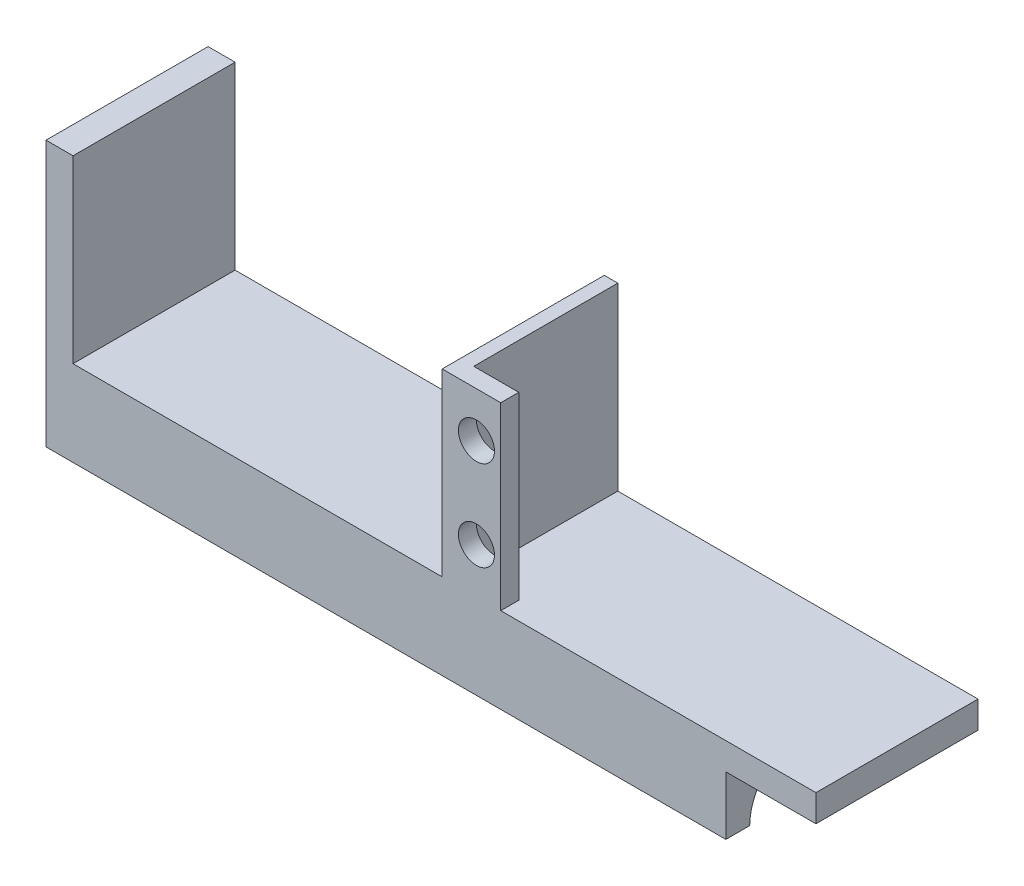
ISO-10303-21;
HEADER;
FILE_DESCRIPTION(('STEP AP214'),'2;1');
FILE_NAME('part.step','',(''),(''),'','','');
FILE_SCHEMA(('AUTOMOTIVE_DESIGN { 1 0 10303 214 1 1 1 1 }'));
ENDSEC;
DATA;
#1=APPLICATION_CONTEXT('core data for automotive mechanical design processes');
#2=APPLICATION_PROTOCOL_DEFINITION('international standard','automotive_design',2000,#1);
#3=PRODUCT_CONTEXT('',#1,'mechanical');
#4=PRODUCT('Part','Part','',(#3));
#5=PRODUCT_RELATED_PRODUCT_CATEGORY('part','',(#4));
#6=PRODUCT_DEFINITION_FORMATION('','',#4);
#7=PRODUCT_DEFINITION_CONTEXT('part definition',#1,'design');
#8=PRODUCT_DEFINITION('design','',#6,#7);
#9=PRODUCT_DEFINITION_SHAPE('','',#8);
#10=(LENGTH_UNIT() NAMED_UNIT(*) SI_UNIT(.MILLI.,.METRE.));
#11=(NAMED_UNIT(*) PLANE_ANGLE_UNIT() SI_UNIT($,.RADIAN.));
#12=(NAMED_UNIT(*) SI_UNIT($,.STERADIAN.) SOLID_ANGLE_UNIT());
#13=UNCERTAINTY_MEASURE_WITH_UNIT(LENGTH_MEASURE(1.E-05),#10,'distance_accuracy_value','');
#14=(GEOMETRIC_REPRESENTATION_CONTEXT(3) GLOBAL_UNCERTAINTY_ASSIGNED_CONTEXT((#13)) GLOBAL_UNIT_ASSIGNED_CONTEXT((#10,
#11,#12)) REPRESENTATION_CONTEXT('',''));
#15=CARTESIAN_POINT('',(0.,0.,0.));
#16=DIRECTION('',(0.,0.,1.));
#17=DIRECTION('',(1.,0.,0.));
#18=AXIS2_PLACEMENT_3D('',#15,#16,#17);
#19=CARTESIAN_POINT('',(22.75,3.,9.));
#20=DIRECTION('',(-1.,0.,0.));
#21=DIRECTION('',(0.,0.,1.));
#22=AXIS2_PLACEMENT_3D('',#19,#20,#21);
#23=PLANE('',#22);
#24=DIRECTION('',(0.,0.,1.));
#25=VECTOR('',#24,1.);
#26=CARTESIAN_POINT('',(22.75,3.,9.));
#27=LINE('',#26,#25);
#28=CARTESIAN_POINT('',(22.75,3.,-9.));
#29=VERTEX_POINT('',#28);
#30=CARTESIAN_POINT('',(22.75,3.,7.));
#31=VERTEX_POINT('',#30);
#32=EDGE_CURVE('E102',#29,#31,#27,.T.);
#33=ORIENTED_EDGE('',*,*,#32,.F.);
#34=DIRECTION('',(0.,-1.,0.));
#35=VECTOR('',#34,1.);
#36=CARTESIAN_POINT('',(22.75,3.,-9.));
#37=LINE('',#36,#35);
#38=CARTESIAN_POINT('',(22.75,23.,-9.));
#39=VERTEX_POINT('',#38);
#40=EDGE_CURVE('E12',#39,#29,#37,.T.);
#41=ORIENTED_EDGE('',*,*,#40,.F.);
#42=DIRECTION('',(0.,0.,-1.));
#43=VECTOR('',#42,1.);
#44=CARTESIAN_POINT('',(22.75,23.,-9.));
#45=LINE('',#44,#43);
#46=CARTESIAN_POINT('',(22.75,23.,7.));
#47=VERTEX_POINT('',#46);
#48=EDGE_CURVE('E107',#47,#39,#45,.T.);
#49=ORIENTED_EDGE('',*,*,#48,.F.);
#50=DIRECTION('',(0.,1.,0.));
#51=VECTOR('',#50,1.);
#52=CARTESIAN_POINT('',(22.75,23.,7.));
#53=LINE('',#52,#51);
#54=EDGE_CURVE('E263',#31,#47,#53,.T.);
#55=ORIENTED_EDGE('',*,*,#54,.F.);
#56=EDGE_LOOP('',(#33,#41,#49,#55));
#57=FACE_BOUND('',#56,.T.);
#58=ADVANCED_FACE('F86',(#57),#23,.F.);
#59=CARTESIAN_POINT('',(-22.75,3.,9.));
#60=DIRECTION('',(0.,0.,-1.));
#61=DIRECTION('',(-1.,0.,0.));
#62=AXIS2_PLACEMENT_3D('',#59,#60,#61);
#63=PLANE('',#62);
#64=DIRECTION('',(0.,-1.,0.));
#65=VECTOR('',#64,1.);
#66=CARTESIAN_POINT('',(52.75,0.,9.));
#67=LINE('',#66,#65);
#68=CARTESIAN_POINT('',(52.75,0.,9.));
#69=VERTEX_POINT('',#68);
#70=CARTESIAN_POINT('',(52.75,-6.5,9.));
#71=VERTEX_POINT('',#70);
#72=EDGE_CURVE('E222',#69,#71,#67,.T.);
#73=ORIENTED_EDGE('',*,*,#72,.F.);
#74=DIRECTION('',(-1.,0.,0.));
#75=VECTOR('',#74,1.);
#76=CARTESIAN_POINT('',(62.75,0.,9.));
#77=LINE('',#76,#75);
#78=CARTESIAN_POINT('',(62.75,0.,9.));
#79=VERTEX_POINT('',#78);
#80=EDGE_CURVE('E207',#79,#69,#77,.T.);
#81=ORIENTED_EDGE('',*,*,#80,.F.);
#82=DIRECTION('',(0.,-1.,0.));
#83=VECTOR('',#82,1.);
#84=CARTESIAN_POINT('',(62.75,0.,9.));
#85=LINE('',#84,#83);
#86=CARTESIAN_POINT('',(62.75,3.,9.));
#87=VERTEX_POINT('',#86);
#88=EDGE_CURVE('E211',#87,#79,#85,.T.);
#89=ORIENTED_EDGE('',*,*,#88,.F.);
#90=DIRECTION('',(-1.,0.,0.));
#91=VECTOR('',#90,1.);
#92=CARTESIAN_POINT('',(62.75,3.,9.));
#93=LINE('',#92,#91);
#94=CARTESIAN_POINT('',(27.75,3.,9.));
#95=VERTEX_POINT('',#94);
#96=EDGE_CURVE('E241',#87,#95,#93,.T.);
#97=ORIENTED_EDGE('',*,*,#96,.T.);
#98=DIRECTION('',(0.,-1.,0.));
#99=VECTOR('',#98,1.);
#100=CARTESIAN_POINT('',(27.75,23.,9.));
#101=LINE('',#100,#99);
#102=CARTESIAN_POINT('',(27.75,23.,9.));
#103=VERTEX_POINT('',#102);
#104=EDGE_CURVE('E259',#103,#95,#101,.T.);
#105=ORIENTED_EDGE('',*,*,#104,.F.);
#106=DIRECTION('',(1.,0.,0.));
#107=VECTOR('',#106,1.);
#108=CARTESIAN_POINT('',(22.75,23.,9.));
#109=LINE('',#108,#107);
#110=CARTESIAN_POINT('',(21.25,23.,9.));
#111=VERTEX_POINT('',#110);
#112=EDGE_CURVE('E260',#111,#103,#109,.T.);
#113=ORIENTED_EDGE('',*,*,#112,.F.);
#114=DIRECTION('',(0.,-1.,0.));
#115=VECTOR('',#114,1.);
#116=CARTESIAN_POINT('',(21.25,23.,9.));
#117=LINE('',#116,#115);
#118=CARTESIAN_POINT('',(21.25,3.,9.));
#119=VERTEX_POINT('',#118);
#120=EDGE_CURVE('E302',#111,#119,#117,.T.);
#121=ORIENTED_EDGE('',*,*,#120,.T.);
#122=DIRECTION('',(1.,0.,0.));
#123=VECTOR('',#122,1.);
#124=CARTESIAN_POINT('',(-22.75,3.,9.));
#125=LINE('',#124,#123);
#126=CARTESIAN_POINT('',(-19.75,3.,9.));
#127=VERTEX_POINT('',#126);
#128=EDGE_CURVE('E301',#127,#119,#125,.T.);
#129=ORIENTED_EDGE('',*,*,#128,.F.);
#130=DIRECTION('',(0.,-1.,0.));
#131=VECTOR('',#130,1.);
#132=CARTESIAN_POINT('',(-19.75,23.,9.));
#133=LINE('',#132,#131);
#134=CARTESIAN_POINT('',(-19.75,23.,9.));
#135=VERTEX_POINT('',#134);
#136=EDGE_CURVE('E296',#135,#127,#133,.T.);
#137=ORIENTED_EDGE('',*,*,#136,.F.);
#138=DIRECTION('',(1.,0.,0.));
#139=VECTOR('',#138,1.);
#140=CARTESIAN_POINT('',(-22.75,23.,9.));
#141=LINE('',#140,#139);
#142=CARTESIAN_POINT('',(-22.75,23.,9.));
#143=VERTEX_POINT('',#142);
#144=EDGE_CURVE('E282',#143,#135,#141,.T.);
#145=ORIENTED_EDGE('',*,*,#144,.F.);
#146=DIRECTION('',(0.,-1.,0.));
#147=VECTOR('',#146,1.);
#148=CARTESIAN_POINT('',(-22.75,3.,9.));
#149=LINE('',#148,#147);
#150=CARTESIAN_POINT('',(-22.75,-6.5,9.));
#151=VERTEX_POINT('',#150);
#152=EDGE_CURVE('E320',#143,#151,#149,.T.);
#153=ORIENTED_EDGE('',*,*,#152,.T.);
#154=DIRECTION('',(1.,0.,0.));
#155=VECTOR('',#154,1.);
#156=CARTESIAN_POINT('',(-22.75,-6.5,9.));
#157=LINE('',#156,#155);
#158=EDGE_CURVE('E227',#151,#71,#157,.T.);
#159=ORIENTED_EDGE('',*,*,#158,.T.);
#160=EDGE_LOOP('',(#73,#81,#89,#97,#105,#113,#121,#129,#137,#145,#153,#159));
#161=FACE_BOUND('',#160,.T.);
#162=CARTESIAN_POINT('',(25.05,8.,9.));
#163=DIRECTION('',(0.,0.,1.));
#164=DIRECTION('',(1.,0.,0.));
#165=AXIS2_PLACEMENT_3D('',#162,#163,#164);
#166=CIRCLE('',#165,2.);
#167=CARTESIAN_POINT('',(27.05,8.,9.));
#168=VERTEX_POINT('',#167);
#169=EDGE_CURVE('E385',#168,#168,#166,.T.);
#170=ORIENTED_EDGE('',*,*,#169,.F.);
#171=EDGE_LOOP('',(#170));
#172=FACE_BOUND('',#171,.T.);
#173=CARTESIAN_POINT('',(25.05,18.,9.));
#174=DIRECTION('',(0.,0.,1.));
#175=DIRECTION('',(1.,0.,0.));
#176=AXIS2_PLACEMENT_3D('',#173,#174,#175);
#177=CIRCLE('',#176,2.);
#178=CARTESIAN_POINT('',(27.05,18.,9.));
#179=VERTEX_POINT('',#178);
#180=EDGE_CURVE('E381',#179,#179,#177,.T.);
#181=ORIENTED_EDGE('',*,*,#180,.F.);
#182=EDGE_LOOP('',(#181));
#183=FACE_BOUND('',#182,.T.);
#184=ADVANCED_FACE('F89',(#161,#172,#183),#63,.F.);
#185=CARTESIAN_POINT('',(-22.75,3.,-9.));
#186=DIRECTION('',(0.,0.,-1.));
#187=DIRECTION('',(-1.,0.,0.));
#188=AXIS2_PLACEMENT_3D('',#185,#186,#187);
#189=PLANE('',#188);
#190=ORIENTED_EDGE('',*,*,#40,.T.);
#191=DIRECTION('',(-1.,0.,0.));
#192=VECTOR('',#191,1.);
#193=CARTESIAN_POINT('',(62.75,3.,-9.));
#194=LINE('',#193,#192);
#195=CARTESIAN_POINT('',(62.75,3.,-9.));
#196=VERTEX_POINT('',#195);
#197=EDGE_CURVE('E230',#196,#29,#194,.T.);
#198=ORIENTED_EDGE('',*,*,#197,.F.);
#199=DIRECTION('',(0.,1.,0.));
#200=VECTOR('',#199,1.);
#201=CARTESIAN_POINT('',(62.75,0.,-9.));
#202=LINE('',#201,#200);
#203=CARTESIAN_POINT('',(62.75,0.,-9.));
#204=VERTEX_POINT('',#203);
#205=EDGE_CURVE('E214',#204,#196,#202,.T.);
#206=ORIENTED_EDGE('',*,*,#205,.F.);
#207=DIRECTION('',(-1.,0.,0.));
#208=VECTOR('',#207,1.);
#209=CARTESIAN_POINT('',(62.75,0.,-9.));
#210=LINE('',#209,#208);
#211=CARTESIAN_POINT('',(52.75,0.,-9.));
#212=VERTEX_POINT('',#211);
#213=EDGE_CURVE('E206',#204,#212,#210,.T.);
#214=ORIENTED_EDGE('',*,*,#213,.T.);
#215=DIRECTION('',(0.,-1.,0.));
#216=VECTOR('',#215,1.);
#217=CARTESIAN_POINT('',(52.75,0.,-9.));
#218=LINE('',#217,#216);
#219=CARTESIAN_POINT('',(52.75,-6.5,-9.));
#220=VERTEX_POINT('',#219);
#221=EDGE_CURVE('E335',#212,#220,#218,.T.);
#222=ORIENTED_EDGE('',*,*,#221,.T.);
#223=DIRECTION('',(1.,0.,0.));
#224=VECTOR('',#223,1.);
#225=CARTESIAN_POINT('',(-22.75,-6.5,-9.));
#226=LINE('',#225,#224);
#227=CARTESIAN_POINT('',(-22.75,-6.5,-9.));
#228=VERTEX_POINT('',#227);
#229=EDGE_CURVE('E333',#228,#220,#226,.T.);
#230=ORIENTED_EDGE('',*,*,#229,.F.);
#231=DIRECTION('',(0.,-1.,0.));
#232=VECTOR('',#231,1.);
#233=CARTESIAN_POINT('',(-22.75,3.,-9.));
#234=LINE('',#233,#232);
#235=CARTESIAN_POINT('',(-22.75,23.,-9.));
#236=VERTEX_POINT('',#235);
#237=EDGE_CURVE('E97',#236,#228,#234,.T.);
#238=ORIENTED_EDGE('',*,*,#237,.F.);
#239=DIRECTION('',(-1.,0.,0.));
#240=VECTOR('',#239,1.);
#241=CARTESIAN_POINT('',(-22.75,23.,-9.));
#242=LINE('',#241,#240);
#243=CARTESIAN_POINT('',(-19.75,23.,-9.));
#244=VERTEX_POINT('',#243);
#245=EDGE_CURVE('E289',#244,#236,#242,.T.);
#246=ORIENTED_EDGE('',*,*,#245,.F.);
#247=DIRECTION('',(0.,-1.,0.));
#248=VECTOR('',#247,1.);
#249=CARTESIAN_POINT('',(-19.75,23.,-9.));
#250=LINE('',#249,#248);
#251=CARTESIAN_POINT('',(-19.75,3.,-9.));
#252=VERTEX_POINT('',#251);
#253=EDGE_CURVE('E292',#244,#252,#250,.T.);
#254=ORIENTED_EDGE('',*,*,#253,.T.);
#255=DIRECTION('',(1.,0.,0.));
#256=VECTOR('',#255,1.);
#257=CARTESIAN_POINT('',(-22.75,3.,-9.));
#258=LINE('',#257,#256);
#259=CARTESIAN_POINT('',(21.25,3.,-9.));
#260=VERTEX_POINT('',#259);
#261=EDGE_CURVE('E314',#252,#260,#258,.T.);
#262=ORIENTED_EDGE('',*,*,#261,.T.);
#263=DIRECTION('',(0.,-1.,0.));
#264=VECTOR('',#263,1.);
#265=CARTESIAN_POINT('',(21.25,23.,-9.));
#266=LINE('',#265,#264);
#267=CARTESIAN_POINT('',(21.25,23.,-9.));
#268=VERTEX_POINT('',#267);
#269=EDGE_CURVE('E277',#268,#260,#266,.T.);
#270=ORIENTED_EDGE('',*,*,#269,.F.);
#271=DIRECTION('',(-1.,0.,0.));
#272=VECTOR('',#271,1.);
#273=CARTESIAN_POINT('',(22.75,23.,-9.));
#274=LINE('',#273,#272);
#275=EDGE_CURVE('E311',#39,#268,#274,.T.);
#276=ORIENTED_EDGE('',*,*,#275,.F.);
#277=EDGE_LOOP('',(#190,#198,#206,#214,#222,#230,#238,#246,#254,#262,#270,#276));
#278=FACE_BOUND('',#277,.T.);
#279=ADVANCED_FACE('F250',(#278),#189,.T.);
#280=CARTESIAN_POINT('',(-22.75,3.,9.));
#281=DIRECTION('',(-1.,0.,0.));
#282=DIRECTION('',(0.,0.,1.));
#283=AXIS2_PLACEMENT_3D('',#280,#281,#282);
#284=PLANE('',#283);
#285=ORIENTED_EDGE('',*,*,#237,.T.);
#286=DIRECTION('',(0.,0.,-1.));
#287=VECTOR('',#286,1.);
#288=CARTESIAN_POINT('',(-22.75,-6.5,-5.64580823289529));
#289=LINE('',#288,#287);
#290=CARTESIAN_POINT('',(-22.75,-6.5,-5.64580823289529));
#291=VERTEX_POINT('',#290);
#292=EDGE_CURVE('E328',#291,#228,#289,.T.);
#293=ORIENTED_EDGE('',*,*,#292,.F.);
#294=CARTESIAN_POINT('',(-22.75,-6.5,0.354191767104708));
#295=DIRECTION('',(1.,0.,0.));
#296=DIRECTION('',(0.,0.,-1.));
#297=AXIS2_PLACEMENT_3D('',#294,#295,#296);
#298=CIRCLE('',#297,6.);
#299=CARTESIAN_POINT('',(-22.75,-6.5,6.35419176710471));
#300=VERTEX_POINT('',#299);
#301=EDGE_CURVE('E341',#291,#300,#298,.T.);
#302=ORIENTED_EDGE('',*,*,#301,.T.);
#303=DIRECTION('',(0.,0.,1.));
#304=VECTOR('',#303,1.);
#305=CARTESIAN_POINT('',(-22.75,-6.5,6.35419176710471));
#306=LINE('',#305,#304);
#307=EDGE_CURVE('E359',#300,#151,#306,.T.);
#308=ORIENTED_EDGE('',*,*,#307,.T.);
#309=ORIENTED_EDGE('',*,*,#152,.F.);
#310=DIRECTION('',(0.,0.,1.));
#311=VECTOR('',#310,1.);
#312=CARTESIAN_POINT('',(-22.75,23.,-9.));
#313=LINE('',#312,#311);
#314=EDGE_CURVE('E283',#236,#143,#313,.T.);
#315=ORIENTED_EDGE('',*,*,#314,.F.);
#316=EDGE_LOOP('',(#285,#293,#302,#308,#309,#315));
#317=FACE_BOUND('',#316,.T.);
#318=ADVANCED_FACE('F323',(#317),#284,.T.);
#319=CARTESIAN_POINT('',(0.,3.,0.));
#320=DIRECTION('',(0.,1.,0.));
#321=DIRECTION('',(0.,0.,1.));
#322=AXIS2_PLACEMENT_3D('',#319,#320,#321);
#323=PLANE('',#322);
#324=DIRECTION('',(0.,0.,-1.));
#325=VECTOR('',#324,1.);
#326=CARTESIAN_POINT('',(-19.75,3.,-9.));
#327=LINE('',#326,#325);
#328=EDGE_CURVE('E284',#127,#252,#327,.T.);
#329=ORIENTED_EDGE('',*,*,#328,.F.);
#330=ORIENTED_EDGE('',*,*,#128,.T.);
#331=DIRECTION('',(0.,0.,1.));
#332=VECTOR('',#331,1.);
#333=CARTESIAN_POINT('',(21.25,3.,-9.));
#334=LINE('',#333,#332);
#335=EDGE_CURVE('E294',#260,#119,#334,.T.);
#336=ORIENTED_EDGE('',*,*,#335,.F.);
#337=ORIENTED_EDGE('',*,*,#261,.F.);
#338=EDGE_LOOP('',(#329,#330,#336,#337));
#339=FACE_BOUND('',#338,.T.);
#340=ADVANCED_FACE('F420',(#339),#323,.T.);
#341=CARTESIAN_POINT('',(21.25,23.,-9.));
#342=DIRECTION('',(1.,0.,0.));
#343=DIRECTION('',(0.,0.,-1.));
#344=AXIS2_PLACEMENT_3D('',#341,#342,#343);
#345=PLANE('',#344);
#346=ORIENTED_EDGE('',*,*,#335,.T.);
#347=ORIENTED_EDGE('',*,*,#120,.F.);
#348=DIRECTION('',(0.,0.,1.));
#349=VECTOR('',#348,1.);
#350=CARTESIAN_POINT('',(21.25,23.,-9.));
#351=LINE('',#350,#349);
#352=EDGE_CURVE('E307',#268,#111,#351,.T.);
#353=ORIENTED_EDGE('',*,*,#352,.F.);
#354=ORIENTED_EDGE('',*,*,#269,.T.);
#355=EDGE_LOOP('',(#346,#347,#353,#354));
#356=FACE_BOUND('',#355,.T.);
#357=ADVANCED_FACE('F423',(#356),#345,.F.);
#358=CARTESIAN_POINT('',(0.,23.,0.));
#359=DIRECTION('',(0.,-1.,0.));
#360=DIRECTION('',(0.,0.,-1.));
#361=AXIS2_PLACEMENT_3D('',#358,#359,#360);
#362=PLANE('',#361);
#363=ORIENTED_EDGE('',*,*,#112,.T.);
#364=DIRECTION('',(0.,0.,1.));
#365=VECTOR('',#364,1.);
#366=CARTESIAN_POINT('',(27.75,23.,9.));
#367=LINE('',#366,#365);
#368=CARTESIAN_POINT('',(27.75,23.,7.));
#369=VERTEX_POINT('',#368);
#370=EDGE_CURVE('E275',#369,#103,#367,.T.);
#371=ORIENTED_EDGE('',*,*,#370,.F.);
#372=DIRECTION('',(-1.,0.,0.));
#373=VECTOR('',#372,1.);
#374=CARTESIAN_POINT('',(27.75,23.,7.));
#375=LINE('',#374,#373);
#376=EDGE_CURVE('E271',#369,#47,#375,.T.);
#377=ORIENTED_EDGE('',*,*,#376,.T.);
#378=ORIENTED_EDGE('',*,*,#48,.T.);
#379=ORIENTED_EDGE('',*,*,#275,.T.);
#380=ORIENTED_EDGE('',*,*,#352,.T.);
#381=EDGE_LOOP('',(#363,#371,#377,#378,#379,#380));
#382=FACE_BOUND('',#381,.T.);
#383=ADVANCED_FACE('F421',(#382),#362,.F.);
#384=CARTESIAN_POINT('',(-19.75,23.,-9.));
#385=DIRECTION('',(-1.,0.,0.));
#386=DIRECTION('',(0.,0.,1.));
#387=AXIS2_PLACEMENT_3D('',#384,#385,#386);
#388=PLANE('',#387);
#389=ORIENTED_EDGE('',*,*,#328,.T.);
#390=ORIENTED_EDGE('',*,*,#253,.F.);
#391=DIRECTION('',(0.,0.,-1.));
#392=VECTOR('',#391,1.);
#393=CARTESIAN_POINT('',(-19.75,23.,-9.));
#394=LINE('',#393,#392);
#395=EDGE_CURVE('E290',#135,#244,#394,.T.);
#396=ORIENTED_EDGE('',*,*,#395,.F.);
#397=ORIENTED_EDGE('',*,*,#136,.T.);
#398=EDGE_LOOP('',(#389,#390,#396,#397));
#399=FACE_BOUND('',#398,.T.);
#400=ADVANCED_FACE('F414',(#399),#388,.F.);
#401=CARTESIAN_POINT('',(0.,23.,0.));
#402=DIRECTION('',(0.,1.,0.));
#403=DIRECTION('',(0.,0.,1.));
#404=AXIS2_PLACEMENT_3D('',#401,#402,#403);
#405=PLANE('',#404);
#406=ORIENTED_EDGE('',*,*,#314,.T.);
#407=ORIENTED_EDGE('',*,*,#144,.T.);
#408=ORIENTED_EDGE('',*,*,#395,.T.);
#409=ORIENTED_EDGE('',*,*,#245,.T.);
#410=EDGE_LOOP('',(#406,#407,#408,#409));
#411=FACE_BOUND('',#410,.T.);
#412=ADVANCED_FACE('F413',(#411),#405,.T.);
#413=CARTESIAN_POINT('',(27.75,23.,7.));
#414=DIRECTION('',(0.,0.,1.));
#415=DIRECTION('',(0.,-1.,0.));
#416=AXIS2_PLACEMENT_3D('',#413,#414,#415);
#417=PLANE('',#416);
#418=CARTESIAN_POINT('',(25.05,8.,7.));
#419=DIRECTION('',(0.,0.,1.));
#420=DIRECTION('',(1.,0.,0.));
#421=AXIS2_PLACEMENT_3D('',#418,#419,#420);
#422=CIRCLE('',#421,2.);
#423=CARTESIAN_POINT('',(27.05,8.,7.));
#424=VERTEX_POINT('',#423);
#425=EDGE_CURVE('E264',#424,#424,#422,.T.);
#426=ORIENTED_EDGE('',*,*,#425,.T.);
#427=EDGE_LOOP('',(#426));
#428=FACE_BOUND('',#427,.T.);
#429=CARTESIAN_POINT('',(25.05,18.,7.));
#430=DIRECTION('',(0.,0.,1.));
#431=DIRECTION('',(1.,0.,0.));
#432=AXIS2_PLACEMENT_3D('',#429,#430,#431);
#433=CIRCLE('',#432,2.);
#434=CARTESIAN_POINT('',(27.05,18.,7.));
#435=VERTEX_POINT('',#434);
#436=EDGE_CURVE('E266',#435,#435,#433,.T.);
#437=ORIENTED_EDGE('',*,*,#436,.T.);
#438=EDGE_LOOP('',(#437));
#439=FACE_BOUND('',#438,.T.);
#440=ORIENTED_EDGE('',*,*,#54,.T.);
#441=ORIENTED_EDGE('',*,*,#376,.F.);
#442=DIRECTION('',(0.,1.,0.));
#443=VECTOR('',#442,1.);
#444=CARTESIAN_POINT('',(27.75,23.,7.));
#445=LINE('',#444,#443);
#446=CARTESIAN_POINT('',(27.75,3.,7.));
#447=VERTEX_POINT('',#446);
#448=EDGE_CURVE('E261',#447,#369,#445,.T.);
#449=ORIENTED_EDGE('',*,*,#448,.F.);
#450=DIRECTION('',(-1.,0.,0.));
#451=VECTOR('',#450,1.);
#452=CARTESIAN_POINT('',(27.75,3.,7.));
#453=LINE('',#452,#451);
#454=EDGE_CURVE('E276',#447,#31,#453,.T.);
#455=ORIENTED_EDGE('',*,*,#454,.T.);
#456=EDGE_LOOP('',(#440,#441,#449,#455));
#457=FACE_BOUND('',#456,.T.);
#458=ADVANCED_FACE('F447',(#428,#439,#457),#417,.F.);
#459=CARTESIAN_POINT('',(27.75,0.,0.));
#460=DIRECTION('',(1.,0.,0.));
#461=DIRECTION('',(0.,0.,-1.));
#462=AXIS2_PLACEMENT_3D('',#459,#460,#461);
#463=PLANE('',#462);
#464=ORIENTED_EDGE('',*,*,#104,.T.);
#465=DIRECTION('',(0.,0.,-1.));
#466=VECTOR('',#465,1.);
#467=CARTESIAN_POINT('',(27.75,3.,9.));
#468=LINE('',#467,#466);
#469=EDGE_CURVE('E254',#95,#447,#468,.T.);
#470=ORIENTED_EDGE('',*,*,#469,.T.);
#471=ORIENTED_EDGE('',*,*,#448,.T.);
#472=ORIENTED_EDGE('',*,*,#370,.T.);
#473=EDGE_LOOP('',(#464,#470,#471,#472));
#474=FACE_BOUND('',#473,.T.);
#475=ADVANCED_FACE('F446',(#474),#463,.T.);
#476=CARTESIAN_POINT('',(25.05,18.,7.));
#477=DIRECTION('',(0.,0.,1.));
#478=DIRECTION('',(1.,0.,0.));
#479=AXIS2_PLACEMENT_3D('',#476,#477,#478);
#480=CYLINDRICAL_SURFACE('',#479,2.);
#481=ORIENTED_EDGE('',*,*,#436,.F.);
#482=EDGE_LOOP('',(#481));
#483=FACE_BOUND('',#482,.T.);
#484=ORIENTED_EDGE('',*,*,#180,.T.);
#485=EDGE_LOOP('',(#484));
#486=FACE_BOUND('',#485,.T.);
#487=ADVANCED_FACE('F455',(#483,#486),#480,.F.);
#488=CARTESIAN_POINT('',(25.05,8.,7.));
#489=DIRECTION('',(0.,0.,1.));
#490=DIRECTION('',(1.,0.,0.));
#491=AXIS2_PLACEMENT_3D('',#488,#489,#490);
#492=CYLINDRICAL_SURFACE('',#491,2.);
#493=ORIENTED_EDGE('',*,*,#425,.F.);
#494=EDGE_LOOP('',(#493));
#495=FACE_BOUND('',#494,.T.);
#496=ORIENTED_EDGE('',*,*,#169,.T.);
#497=EDGE_LOOP('',(#496));
#498=FACE_BOUND('',#497,.T.);
#499=ADVANCED_FACE('F458',(#495,#498),#492,.F.);
#500=CARTESIAN_POINT('',(52.75,0.,0.));
#501=DIRECTION('',(1.,0.,0.));
#502=DIRECTION('',(0.,0.,-1.));
#503=AXIS2_PLACEMENT_3D('',#500,#501,#502);
#504=PLANE('',#503);
#505=DIRECTION('',(0.,0.,-1.));
#506=VECTOR('',#505,1.);
#507=CARTESIAN_POINT('',(52.75,0.,9.));
#508=LINE('',#507,#506);
#509=EDGE_CURVE('E234',#69,#212,#508,.T.);
#510=ORIENTED_EDGE('',*,*,#509,.F.);
#511=ORIENTED_EDGE('',*,*,#72,.T.);
#512=DIRECTION('',(0.,0.,1.));
#513=VECTOR('',#512,1.);
#514=CARTESIAN_POINT('',(52.75,-6.5,6.35419176710471));
#515=LINE('',#514,#513);
#516=CARTESIAN_POINT('',(52.75,-6.5,6.35419176710471));
#517=VERTEX_POINT('',#516);
#518=EDGE_CURVE('E369',#517,#71,#515,.T.);
#519=ORIENTED_EDGE('',*,*,#518,.F.);
#520=CARTESIAN_POINT('',(52.75,-6.5,0.354191767104708));
#521=DIRECTION('',(1.,0.,0.));
#522=DIRECTION('',(0.,0.,-1.));
#523=AXIS2_PLACEMENT_3D('',#520,#521,#522);
#524=CIRCLE('',#523,6.);
#525=CARTESIAN_POINT('',(52.75,-6.5,-5.64580823289529));
#526=VERTEX_POINT('',#525);
#527=EDGE_CURVE('E355',#526,#517,#524,.T.);
#528=ORIENTED_EDGE('',*,*,#527,.F.);
#529=DIRECTION('',(0.,0.,-1.));
#530=VECTOR('',#529,1.);
#531=CARTESIAN_POINT('',(52.75,-6.5,-5.64580823289529));
#532=LINE('',#531,#530);
#533=EDGE_CURVE('E338',#526,#220,#532,.T.);
#534=ORIENTED_EDGE('',*,*,#533,.T.);
#535=ORIENTED_EDGE('',*,*,#221,.F.);
#536=EDGE_LOOP('',(#510,#511,#519,#528,#534,#535));
#537=FACE_BOUND('',#536,.T.);
#538=ADVANCED_FACE('F396',(#537),#504,.T.);
#539=CARTESIAN_POINT('',(-22.75,-6.5,-5.64580823289529));
#540=DIRECTION('',(0.,-1.,0.));
#541=DIRECTION('',(0.,0.,-1.));
#542=AXIS2_PLACEMENT_3D('',#539,#540,#541);
#543=PLANE('',#542);
#544=ORIENTED_EDGE('',*,*,#533,.F.);
#545=DIRECTION('',(1.,0.,0.));
#546=VECTOR('',#545,1.);
#547=CARTESIAN_POINT('',(-22.75,-6.5,-5.64580823289529));
#548=LINE('',#547,#546);
#549=EDGE_CURVE('E336',#291,#526,#548,.T.);
#550=ORIENTED_EDGE('',*,*,#549,.F.);
#551=ORIENTED_EDGE('',*,*,#292,.T.);
#552=ORIENTED_EDGE('',*,*,#229,.T.);
#553=EDGE_LOOP('',(#544,#550,#551,#552));
#554=FACE_BOUND('',#553,.T.);
#555=ADVANCED_FACE('F337',(#554),#543,.T.);
#556=CARTESIAN_POINT('',(-22.75,-6.5,0.354191767104708));
#557=DIRECTION('',(1.,0.,0.));
#558=DIRECTION('',(0.,0.,-1.));
#559=AXIS2_PLACEMENT_3D('',#556,#557,#558);
#560=CYLINDRICAL_SURFACE('',#559,6.);
#561=ORIENTED_EDGE('',*,*,#527,.T.);
#562=DIRECTION('',(1.,0.,0.));
#563=VECTOR('',#562,1.);
#564=CARTESIAN_POINT('',(-22.75,-6.5,6.35419176710471));
#565=LINE('',#564,#563);
#566=EDGE_CURVE('E362',#300,#517,#565,.T.);
#567=ORIENTED_EDGE('',*,*,#566,.F.);
#568=ORIENTED_EDGE('',*,*,#301,.F.);
#569=ORIENTED_EDGE('',*,*,#549,.T.);
#570=EDGE_LOOP('',(#561,#567,#568,#569));
#571=FACE_BOUND('',#570,.T.);
#572=ADVANCED_FACE('F402',(#571),#560,.F.);
#573=CARTESIAN_POINT('',(-22.75,-6.5,6.35419176710471));
#574=DIRECTION('',(0.,1.,0.));
#575=DIRECTION('',(0.,0.,1.));
#576=AXIS2_PLACEMENT_3D('',#573,#574,#575);
#577=PLANE('',#576);
#578=ORIENTED_EDGE('',*,*,#518,.T.);
#579=ORIENTED_EDGE('',*,*,#158,.F.);
#580=ORIENTED_EDGE('',*,*,#307,.F.);
#581=ORIENTED_EDGE('',*,*,#566,.T.);
#582=EDGE_LOOP('',(#578,#579,#580,#581));
#583=FACE_BOUND('',#582,.T.);
#584=ADVANCED_FACE('F403',(#583),#577,.F.);
#585=CARTESIAN_POINT('',(62.75,0.,9.));
#586=DIRECTION('',(0.,1.,0.));
#587=DIRECTION('',(0.,0.,1.));
#588=AXIS2_PLACEMENT_3D('',#585,#586,#587);
#589=PLANE('',#588);
#590=ORIENTED_EDGE('',*,*,#80,.T.);
#591=ORIENTED_EDGE('',*,*,#509,.T.);
#592=ORIENTED_EDGE('',*,*,#213,.F.);
#593=DIRECTION('',(0.,0.,-1.));
#594=VECTOR('',#593,1.);
#595=CARTESIAN_POINT('',(62.75,0.,9.));
#596=LINE('',#595,#594);
#597=EDGE_CURVE('E203',#79,#204,#596,.T.);
#598=ORIENTED_EDGE('',*,*,#597,.F.);
#599=EDGE_LOOP('',(#590,#591,#592,#598));
#600=FACE_BOUND('',#599,.T.);
#601=ADVANCED_FACE('F201',(#600),#589,.F.);
#602=CARTESIAN_POINT('',(62.75,3.,9.));
#603=DIRECTION('',(0.,-1.,0.));
#604=DIRECTION('',(0.,0.,-1.));
#605=AXIS2_PLACEMENT_3D('',#602,#603,#604);
#606=PLANE('',#605);
#607=ORIENTED_EDGE('',*,*,#454,.F.);
#608=ORIENTED_EDGE('',*,*,#469,.F.);
#609=ORIENTED_EDGE('',*,*,#96,.F.);
#610=DIRECTION('',(0.,0.,1.));
#611=VECTOR('',#610,1.);
#612=CARTESIAN_POINT('',(62.75,3.,9.));
#613=LINE('',#612,#611);
#614=EDGE_CURVE('E220',#196,#87,#613,.T.);
#615=ORIENTED_EDGE('',*,*,#614,.F.);
#616=ORIENTED_EDGE('',*,*,#197,.T.);
#617=ORIENTED_EDGE('',*,*,#32,.T.);
#618=EDGE_LOOP('',(#607,#608,#609,#615,#616,#617));
#619=FACE_BOUND('',#618,.T.);
#620=ADVANCED_FACE('F252',(#619),#606,.F.);
#621=CARTESIAN_POINT('',(62.75,0.,0.));
#622=DIRECTION('',(-1.,0.,0.));
#623=DIRECTION('',(0.,0.,1.));
#624=AXIS2_PLACEMENT_3D('',#621,#622,#623);
#625=PLANE('',#624);
#626=ORIENTED_EDGE('',*,*,#88,.T.);
#627=ORIENTED_EDGE('',*,*,#597,.T.);
#628=ORIENTED_EDGE('',*,*,#205,.T.);
#629=ORIENTED_EDGE('',*,*,#614,.T.);
#630=EDGE_LOOP('',(#626,#627,#628,#629));
#631=FACE_BOUND('',#630,.T.);
#632=ADVANCED_FACE('F212',(#631),#625,.F.);
#633=CLOSED_SHELL('',(#58,#184,#279,#318,#340,#357,#383,#400,#412,#458,#475,#487,#499,#538,#555,
#572,#584,#601,#620,#632));
#634=MANIFOLD_SOLID_BREP('B2',#633);
#635=ADVANCED_BREP_SHAPE_REPRESENTATION('',(#18,#634),#14);
#636=SHAPE_DEFINITION_REPRESENTATION(#9,#635);
ENDSEC;
END-ISO-10303-21;
